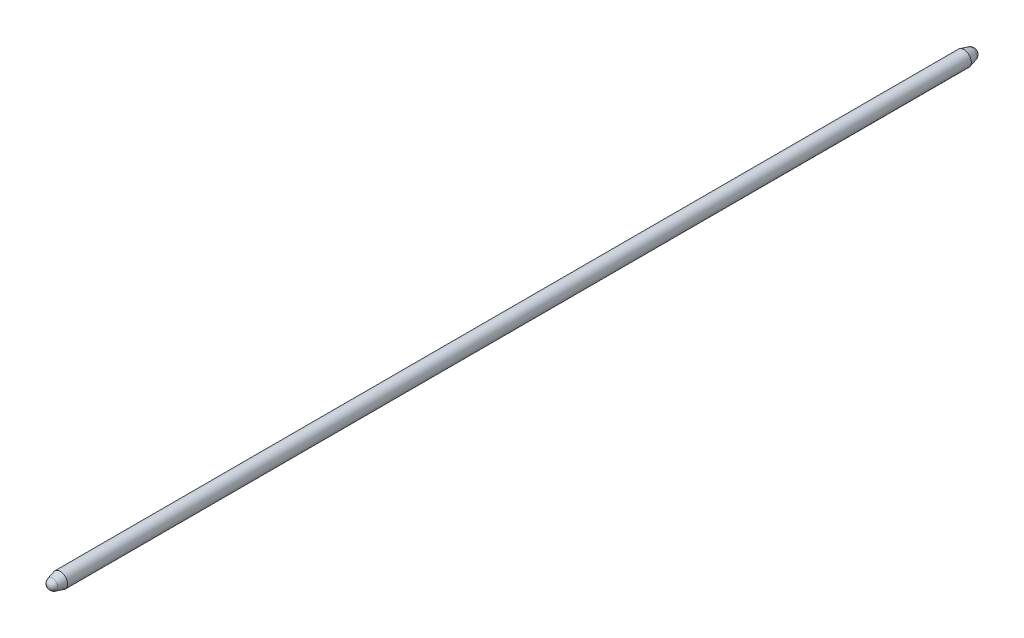
ISO-10303-21;
HEADER;
FILE_DESCRIPTION(('STEP AP214'),'2;1');
FILE_NAME('part.step','',(''),(''),'','','');
FILE_SCHEMA(('AUTOMOTIVE_DESIGN { 1 0 10303 214 1 1 1 1 }'));
ENDSEC;
DATA;
#1=APPLICATION_CONTEXT('core data for automotive mechanical design processes');
#2=APPLICATION_PROTOCOL_DEFINITION('international standard','automotive_design',2000,#1);
#3=PRODUCT_CONTEXT('',#1,'mechanical');
#4=PRODUCT('Part','Part','',(#3));
#5=PRODUCT_RELATED_PRODUCT_CATEGORY('part','',(#4));
#6=PRODUCT_DEFINITION_FORMATION('','',#4);
#7=PRODUCT_DEFINITION_CONTEXT('part definition',#1,'design');
#8=PRODUCT_DEFINITION('design','',#6,#7);
#9=PRODUCT_DEFINITION_SHAPE('','',#8);
#10=(LENGTH_UNIT() NAMED_UNIT(*) SI_UNIT(.MILLI.,.METRE.));
#11=(NAMED_UNIT(*) PLANE_ANGLE_UNIT() SI_UNIT($,.RADIAN.));
#12=(NAMED_UNIT(*) SI_UNIT($,.STERADIAN.) SOLID_ANGLE_UNIT());
#13=UNCERTAINTY_MEASURE_WITH_UNIT(LENGTH_MEASURE(1.E-05),#10,'distance_accuracy_value','');
#14=(GEOMETRIC_REPRESENTATION_CONTEXT(3) GLOBAL_UNCERTAINTY_ASSIGNED_CONTEXT((#13)) GLOBAL_UNIT_ASSIGNED_CONTEXT((#10,
#11,#12)) REPRESENTATION_CONTEXT('',''));
#15=CARTESIAN_POINT('',(0.,0.,0.));
#16=DIRECTION('',(0.,0.,1.));
#17=DIRECTION('',(1.,0.,0.));
#18=AXIS2_PLACEMENT_3D('',#15,#16,#17);
#19=CARTESIAN_POINT('',(0.,0.,-1558.91190254016));
#20=DIRECTION('',(0.,0.,-1.));
#21=DIRECTION('',(0.,1.,0.));
#22=AXIS2_PLACEMENT_3D('',#19,#20,#21);
#23=SPHERICAL_SURFACE('',#22,19.05);
#24=CARTESIAN_POINT('',(0.,0.,-1563.84240534937));
#25=DIRECTION('',(0.,0.,-1.));
#26=DIRECTION('',(0.,1.,0.));
#27=AXIS2_PLACEMENT_3D('',#24,#25,#26);
#28=CIRCLE('',#27,18.4008869908067);
#29=CARTESIAN_POINT('',(0.,18.4008869908068,-1563.84240534937));
#30=VERTEX_POINT('',#29);
#31=EDGE_CURVE('E10',#30,#30,#28,.T.);
#32=ORIENTED_EDGE('',*,*,#31,.T.);
#33=EDGE_LOOP('',(#32));
#34=FACE_BOUND('',#33,.T.);
#35=ADVANCED_FACE('F31',(#34),#23,.T.);
#36=CARTESIAN_POINT('',(0.,0.,-1563.84240534937));
#37=DIRECTION('',(0.,0.,1.));
#38=DIRECTION('',(0.,-1.,0.));
#39=AXIS2_PLACEMENT_3D('',#36,#37,#38);
#40=CONICAL_SURFACE('',#39,18.4008869908067,0.26179938779915);
#41=CARTESIAN_POINT('',(0.,0.,-1537.72135999114));
#42=DIRECTION('',(0.,0.,-1.));
#43=DIRECTION('',(0.,1.,0.));
#44=AXIS2_PLACEMENT_3D('',#41,#42,#43);
#45=CIRCLE('',#44,25.4);
#46=CARTESIAN_POINT('',(0.,25.4,-1537.72135999114));
#47=VERTEX_POINT('',#46);
#48=EDGE_CURVE('E38',#47,#47,#45,.T.);
#49=ORIENTED_EDGE('',*,*,#48,.T.);
#50=EDGE_LOOP('',(#49));
#51=FACE_BOUND('',#50,.T.);
#52=ORIENTED_EDGE('',*,*,#31,.F.);
#53=EDGE_LOOP('',(#52));
#54=FACE_BOUND('',#53,.T.);
#55=ADVANCED_FACE('F86',(#51,#54),#40,.T.);
#56=CARTESIAN_POINT('',(0.,0.,-1577.96190254016));
#57=DIRECTION('',(0.,0.,-1.));
#58=DIRECTION('',(0.,1.,0.));
#59=AXIS2_PLACEMENT_3D('',#56,#57,#58);
#60=CYLINDRICAL_SURFACE('',#59,25.4);
#61=CARTESIAN_POINT('',(0.,0.,1537.72135999114));
#62=DIRECTION('',(0.,0.,-1.));
#63=DIRECTION('',(0.,1.,0.));
#64=AXIS2_PLACEMENT_3D('',#61,#62,#63);
#65=CIRCLE('',#64,25.4);
#66=CARTESIAN_POINT('',(0.,25.4,1537.72135999114));
#67=VERTEX_POINT('',#66);
#68=EDGE_CURVE('E42',#67,#67,#65,.T.);
#69=ORIENTED_EDGE('',*,*,#68,.T.);
#70=EDGE_LOOP('',(#69));
#71=FACE_BOUND('',#70,.T.);
#72=ORIENTED_EDGE('',*,*,#48,.F.);
#73=EDGE_LOOP('',(#72));
#74=FACE_BOUND('',#73,.T.);
#75=ADVANCED_FACE('F83',(#71,#74),#60,.T.);
#76=CARTESIAN_POINT('',(0.,0.,1537.72135999114));
#77=DIRECTION('',(0.,0.,-1.));
#78=DIRECTION('',(0.,1.,0.));
#79=AXIS2_PLACEMENT_3D('',#76,#77,#78);
#80=CONICAL_SURFACE('',#79,25.4,0.26179938779915);
#81=CARTESIAN_POINT('',(0.,0.,1563.84240534937));
#82=DIRECTION('',(0.,0.,-1.));
#83=DIRECTION('',(0.,1.,0.));
#84=AXIS2_PLACEMENT_3D('',#81,#82,#83);
#85=CIRCLE('',#84,18.4008869908068);
#86=CARTESIAN_POINT('',(0.,18.4008869908068,1563.84240534937));
#87=VERTEX_POINT('',#86);
#88=EDGE_CURVE('E46',#87,#87,#85,.T.);
#89=ORIENTED_EDGE('',*,*,#88,.T.);
#90=EDGE_LOOP('',(#89));
#91=FACE_BOUND('',#90,.T.);
#92=ORIENTED_EDGE('',*,*,#68,.F.);
#93=EDGE_LOOP('',(#92));
#94=FACE_BOUND('',#93,.T.);
#95=ADVANCED_FACE('F79',(#91,#94),#80,.T.);
#96=CARTESIAN_POINT('',(0.,0.,1558.91190254016));
#97=DIRECTION('',(0.,0.,-1.));
#98=DIRECTION('',(0.,1.,0.));
#99=AXIS2_PLACEMENT_3D('',#96,#97,#98);
#100=SPHERICAL_SURFACE('',#99,19.05);
#101=ORIENTED_EDGE('',*,*,#88,.F.);
#102=EDGE_LOOP('',(#101));
#103=FACE_BOUND('',#102,.T.);
#104=ADVANCED_FACE('F77',(#103),#100,.T.);
#105=CLOSED_SHELL('',(#35,#55,#75,#95,#104));
#106=CARTESIAN_POINT('',(0.,0.,1537.72135999114));
#107=DIRECTION('',(0.,0.,-1.));
#108=DIRECTION('',(0.,1.,0.));
#109=AXIS2_PLACEMENT_3D('',#106,#107,#108);
#110=PLANE('',#109);
#111=CARTESIAN_POINT('',(0.,0.,1537.72135999114));
#112=DIRECTION('',(0.,0.,-1.));
#113=DIRECTION('',(0.,1.,0.));
#114=AXIS2_PLACEMENT_3D('',#111,#112,#113);
#115=CIRCLE('',#114,22.987);
#116=CARTESIAN_POINT('',(0.,22.987,1537.72135999114));
#117=VERTEX_POINT('',#116);
#118=EDGE_CURVE('E51',#117,#117,#115,.T.);
#119=ORIENTED_EDGE('',*,*,#118,.T.);
#120=EDGE_LOOP('',(#119));
#121=FACE_BOUND('',#120,.T.);
#122=ADVANCED_FACE('F68',(#121),#110,.T.);
#123=CARTESIAN_POINT('',(0.,0.,-1577.96190254016));
#124=DIRECTION('',(0.,0.,-1.));
#125=DIRECTION('',(0.,1.,0.));
#126=AXIS2_PLACEMENT_3D('',#123,#124,#125);
#127=CYLINDRICAL_SURFACE('',#126,22.987);
#128=CARTESIAN_POINT('',(0.,0.,-1537.72135999114));
#129=DIRECTION('',(0.,0.,-1.));
#130=DIRECTION('',(0.,1.,0.));
#131=AXIS2_PLACEMENT_3D('',#128,#129,#130);
#132=CIRCLE('',#131,22.987);
#133=CARTESIAN_POINT('',(0.,22.987,-1537.72135999114));
#134=VERTEX_POINT('',#133);
#135=EDGE_CURVE('E54',#134,#134,#132,.T.);
#136=ORIENTED_EDGE('',*,*,#135,.T.);
#137=EDGE_LOOP('',(#136));
#138=FACE_BOUND('',#137,.T.);
#139=ORIENTED_EDGE('',*,*,#118,.F.);
#140=EDGE_LOOP('',(#139));
#141=FACE_BOUND('',#140,.T.);
#142=ADVANCED_FACE('F58',(#138,#141),#127,.F.);
#143=CARTESIAN_POINT('',(0.,0.,-1537.72135999114));
#144=DIRECTION('',(0.,0.,1.));
#145=DIRECTION('',(0.,-1.,0.));
#146=AXIS2_PLACEMENT_3D('',#143,#144,#145);
#147=PLANE('',#146);
#148=ORIENTED_EDGE('',*,*,#135,.F.);
#149=EDGE_LOOP('',(#148));
#150=FACE_BOUND('',#149,.T.);
#151=ADVANCED_FACE('F61',(#150),#147,.T.);
#152=CLOSED_SHELL('',(#122,#142,#151));
#153=ORIENTED_CLOSED_SHELL('',*,#152,.T.);
#154=BREP_WITH_VOIDS('B2',#105,(#153));
#155=ADVANCED_BREP_SHAPE_REPRESENTATION('',(#18,#154),#14);
#156=SHAPE_DEFINITION_REPRESENTATION(#9,#155);
ENDSEC;
END-ISO-10303-21;
